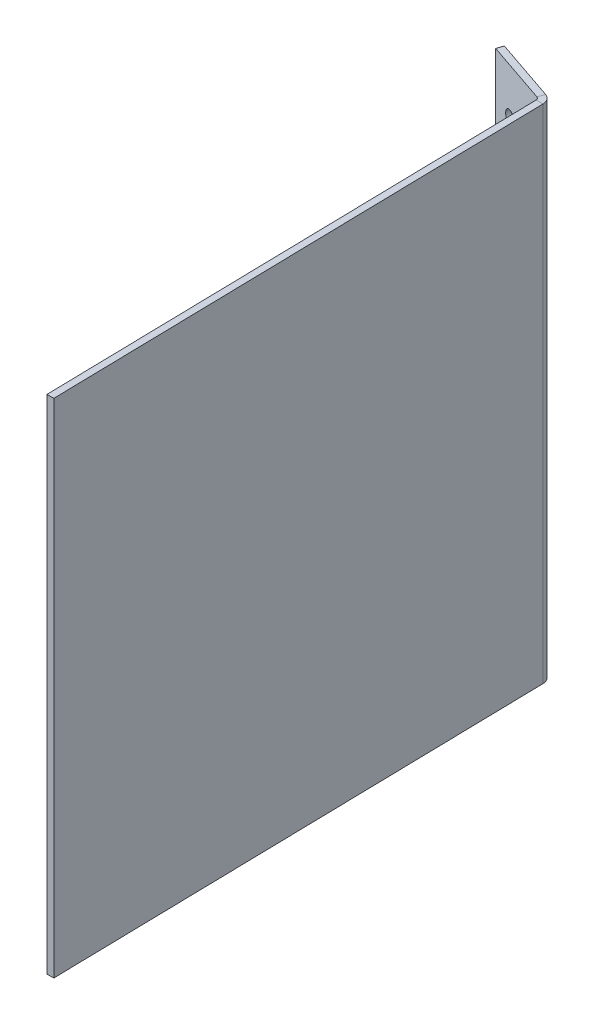
ISO-10303-21;
HEADER;
FILE_DESCRIPTION(('STEP AP214'),'2;1');
FILE_NAME('part.step','',(''),(''),'','','');
FILE_SCHEMA(('AUTOMOTIVE_DESIGN { 1 0 10303 214 1 1 1 1 }'));
ENDSEC;
DATA;
#1=APPLICATION_CONTEXT('core data for automotive mechanical design processes');
#2=APPLICATION_PROTOCOL_DEFINITION('international standard','automotive_design',2000,#1);
#3=PRODUCT_CONTEXT('',#1,'mechanical');
#4=PRODUCT('Part','Part','',(#3));
#5=PRODUCT_RELATED_PRODUCT_CATEGORY('part','',(#4));
#6=PRODUCT_DEFINITION_FORMATION('','',#4);
#7=PRODUCT_DEFINITION_CONTEXT('part definition',#1,'design');
#8=PRODUCT_DEFINITION('design','',#6,#7);
#9=PRODUCT_DEFINITION_SHAPE('','',#8);
#10=(LENGTH_UNIT() NAMED_UNIT(*) SI_UNIT(.MILLI.,.METRE.));
#11=(NAMED_UNIT(*) PLANE_ANGLE_UNIT() SI_UNIT($,.RADIAN.));
#12=(NAMED_UNIT(*) SI_UNIT($,.STERADIAN.) SOLID_ANGLE_UNIT());
#13=UNCERTAINTY_MEASURE_WITH_UNIT(LENGTH_MEASURE(1.E-05),#10,'distance_accuracy_value','');
#14=(GEOMETRIC_REPRESENTATION_CONTEXT(3) GLOBAL_UNCERTAINTY_ASSIGNED_CONTEXT((#13)) GLOBAL_UNIT_ASSIGNED_CONTEXT((#10,
#11,#12)) REPRESENTATION_CONTEXT('',''));
#15=CARTESIAN_POINT('',(0.,0.,0.));
#16=DIRECTION('',(0.,0.,1.));
#17=DIRECTION('',(1.,0.,0.));
#18=AXIS2_PLACEMENT_3D('',#15,#16,#17);
#19=CARTESIAN_POINT('',(-2.76921264471335,110.,-110.142664392987));
#20=DIRECTION('',(0.,1.,0.));
#21=DIRECTION('',(0.,0.,1.));
#22=AXIS2_PLACEMENT_3D('',#19,#20,#21);
#23=PLANE('',#22);
#24=DIRECTION('',(0.322460871920296,0.,-0.946582794096957));
#25=VECTOR('',#24,1.);
#26=CARTESIAN_POINT('',(-2.76921264471335,110.,-110.142664392987));
#27=LINE('',#26,#25);
#28=CARTESIAN_POINT('',(-2.76921264471335,110.,-110.142664392987));
#29=VERTEX_POINT('',#28);
#30=CARTESIAN_POINT('',(-2.2855213368329,110.,-111.562538584132));
#31=VERTEX_POINT('',#30);
#32=EDGE_CURVE('E11',#29,#31,#27,.T.);
#33=ORIENTED_EDGE('',*,*,#32,.F.);
#34=CARTESIAN_POINT('',(-3.00673732296983,110.,-109.445411506855));
#35=DIRECTION('',(0.,-1.,0.));
#36=DIRECTION('',(0.,0.,-1.));
#37=AXIS2_PLACEMENT_3D('',#34,#35,#36);
#38=CIRCLE('',#37,0.7366);
#39=CARTESIAN_POINT('',(-2.27029570654942,110.,-109.460685851492));
#40=VERTEX_POINT('',#39);
#41=EDGE_CURVE('E134',#40,#29,#38,.F.);
#42=ORIENTED_EDGE('',*,*,#41,.F.);
#43=DIRECTION('',(-0.999784980206917,0.,0.0207362810710025));
#44=VECTOR('',#43,1.);
#45=CARTESIAN_POINT('',(-0.770618236239044,110.,-109.491790273099));
#46=LINE('',#45,#44);
#47=CARTESIAN_POINT('',(-0.770618236239044,110.,-109.491790273099));
#48=VERTEX_POINT('',#47);
#49=EDGE_CURVE('E45',#48,#40,#46,.T.);
#50=ORIENTED_EDGE('',*,*,#49,.F.);
#51=CARTESIAN_POINT('',(-3.00673732296983,110.,-109.445411506855));
#52=DIRECTION('',(0.,1.,0.));
#53=DIRECTION('',(1.,0.,0.));
#54=AXIS2_PLACEMENT_3D('',#51,#52,#53);
#55=CIRCLE('',#54,2.2366);
#56=EDGE_CURVE('E127',#48,#31,#55,.T.);
#57=ORIENTED_EDGE('',*,*,#56,.T.);
#58=EDGE_LOOP('',(#33,#42,#50,#57));
#59=FACE_BOUND('',#58,.T.);
#60=ADVANCED_FACE('F37',(#59),#23,.T.);
#61=CARTESIAN_POINT('',(-0.770618236239044,110.,-109.491790273099));
#62=DIRECTION('',(0.,1.,0.));
#63=DIRECTION('',(0.,0.,1.));
#64=AXIS2_PLACEMENT_3D('',#61,#62,#63);
#65=PLANE('',#64);
#66=DIRECTION('',(-0.946582794096957,0.,-0.322460871920296));
#67=VECTOR('',#66,1.);
#68=CARTESIAN_POINT('',(-2.28099091780536,110.,-109.976347822761));
#69=LINE('',#68,#67);
#70=CARTESIAN_POINT('',(-16.4797328292597,110.,-114.813260901565));
#71=VERTEX_POINT('',#70);
#72=EDGE_CURVE('E184',#29,#71,#69,.T.);
#73=ORIENTED_EDGE('',*,*,#72,.F.);
#74=ORIENTED_EDGE('',*,*,#32,.T.);
#75=DIRECTION('',(-0.946582794096957,0.,-0.322460871920296));
#76=VECTOR('',#75,1.);
#77=CARTESIAN_POINT('',(-1.79729960992492,110.,-111.396222013906));
#78=LINE('',#77,#76);
#79=CARTESIAN_POINT('',(-15.9960415213793,110.,-116.233135092711));
#80=VERTEX_POINT('',#79);
#81=EDGE_CURVE('E93',#31,#80,#78,.T.);
#82=ORIENTED_EDGE('',*,*,#81,.T.);
#83=DIRECTION('',(0.322460871920295,0.,-0.946582794096958));
#84=VECTOR('',#83,1.);
#85=CARTESIAN_POINT('',(-16.4797328292597,110.,-114.813260901565));
#86=LINE('',#85,#84);
#87=EDGE_CURVE('E357',#71,#80,#86,.T.);
#88=ORIENTED_EDGE('',*,*,#87,.F.);
#89=EDGE_LOOP('',(#73,#74,#82,#88));
#90=FACE_BOUND('',#89,.T.);
#91=ADVANCED_FACE('F192',(#90),#65,.T.);
#92=CARTESIAN_POINT('',(-2.27029570654942,0.,-109.460685851492));
#93=DIRECTION('',(0.,-1.,0.));
#94=DIRECTION('',(0.,0.,-1.));
#95=AXIS2_PLACEMENT_3D('',#92,#93,#94);
#96=PLANE('',#95);
#97=DIRECTION('',(0.999784980206917,0.,-0.0207362810710025));
#98=VECTOR('',#97,1.);
#99=CARTESIAN_POINT('',(-2.27029570654942,0.,-109.460685851492));
#100=LINE('',#99,#98);
#101=CARTESIAN_POINT('',(-2.27029570654942,0.,-109.460685851492));
#102=VERTEX_POINT('',#101);
#103=CARTESIAN_POINT('',(-0.770618236239044,0.,-109.491790273099));
#104=VERTEX_POINT('',#103);
#105=EDGE_CURVE('E80',#102,#104,#100,.T.);
#106=ORIENTED_EDGE('',*,*,#105,.F.);
#107=CARTESIAN_POINT('',(-3.00673732296983,0.,-109.445411506855));
#108=DIRECTION('',(0.,-1.,0.));
#109=DIRECTION('',(0.,0.,-1.));
#110=AXIS2_PLACEMENT_3D('',#107,#108,#109);
#111=CIRCLE('',#110,0.7366);
#112=CARTESIAN_POINT('',(-2.76921264471335,0.,-110.142664392987));
#113=VERTEX_POINT('',#112);
#114=EDGE_CURVE('E150',#102,#113,#111,.F.);
#115=ORIENTED_EDGE('',*,*,#114,.T.);
#116=DIRECTION('',(-0.322460871920296,0.,0.946582794096957));
#117=VECTOR('',#116,1.);
#118=CARTESIAN_POINT('',(-2.2855213368329,0.,-111.562538584132));
#119=LINE('',#118,#117);
#120=CARTESIAN_POINT('',(-2.2855213368329,0.,-111.562538584132));
#121=VERTEX_POINT('',#120);
#122=EDGE_CURVE('E87',#121,#113,#119,.T.);
#123=ORIENTED_EDGE('',*,*,#122,.F.);
#124=CARTESIAN_POINT('',(-3.00673732296983,0.,-109.445411506855));
#125=DIRECTION('',(0.,1.,0.));
#126=DIRECTION('',(1.,0.,0.));
#127=AXIS2_PLACEMENT_3D('',#124,#125,#126);
#128=CIRCLE('',#127,2.2366);
#129=EDGE_CURVE('E157',#104,#121,#128,.T.);
#130=ORIENTED_EDGE('',*,*,#129,.F.);
#131=EDGE_LOOP('',(#106,#115,#123,#130));
#132=FACE_BOUND('',#131,.T.);
#133=ADVANCED_FACE('F190',(#132),#96,.T.);
#134=CARTESIAN_POINT('',(-2.2855213368329,0.,-111.562538584132));
#135=DIRECTION('',(0.,-1.,0.));
#136=DIRECTION('',(0.,0.,-1.));
#137=AXIS2_PLACEMENT_3D('',#134,#135,#136);
#138=PLANE('',#137);
#139=DIRECTION('',(-0.0207362810709579,0.,-0.999784980206918));
#140=VECTOR('',#139,1.);
#141=CARTESIAN_POINT('',(0.,0.,0.));
#142=LINE('',#141,#140);
#143=CARTESIAN_POINT('',(0.,0.,0.));
#144=VERTEX_POINT('',#143);
#145=EDGE_CURVE('E152',#144,#102,#142,.T.);
#146=ORIENTED_EDGE('',*,*,#145,.T.);
#147=ORIENTED_EDGE('',*,*,#105,.T.);
#148=DIRECTION('',(-0.0207362810709579,0.,-0.999784980206917));
#149=VECTOR('',#148,1.);
#150=CARTESIAN_POINT('',(1.49967747031038,0.,-0.0311044216064368));
#151=LINE('',#150,#149);
#152=CARTESIAN_POINT('',(1.49967747031038,0.,-0.0311044216064368));
#153=VERTEX_POINT('',#152);
#154=EDGE_CURVE('E155',#153,#104,#151,.T.);
#155=ORIENTED_EDGE('',*,*,#154,.F.);
#156=DIRECTION('',(-0.999784980206917,0.,0.0207362810709579));
#157=VECTOR('',#156,1.);
#158=CARTESIAN_POINT('',(1.49967747031038,0.,-0.0311044216064368));
#159=LINE('',#158,#157);
#160=EDGE_CURVE('E115',#153,#144,#159,.T.);
#161=ORIENTED_EDGE('',*,*,#160,.T.);
#162=EDGE_LOOP('',(#146,#147,#155,#161));
#163=FACE_BOUND('',#162,.T.);
#164=ADVANCED_FACE('F186',(#163),#138,.T.);
#165=CARTESIAN_POINT('',(-1.79729960992492,110.,-111.396222013906));
#166=DIRECTION('',(-0.322460871920296,0.,0.946582794096957));
#167=DIRECTION('',(0.946582794096957,0.,0.322460871920296));
#168=AXIS2_PLACEMENT_3D('',#165,#166,#167);
#169=PLANE('',#168);
#170=CARTESIAN_POINT('',(-11.2631275508945,9.99999999999999,-114.620830733109));
#171=DIRECTION('',(0.322460871920295,0.,-0.946582794096957));
#172=DIRECTION('',(-0.946582794096957,0.,-0.322460871920295));
#173=AXIS2_PLACEMENT_3D('',#170,#171,#172);
#174=CIRCLE('',#173,1.49999999999999);
#175=CARTESIAN_POINT('',(-12.6830017420399,9.99999999999999,-115.10452204099));
#176=VERTEX_POINT('',#175);
#177=EDGE_CURVE('E344',#176,#176,#174,.T.);
#178=ORIENTED_EDGE('',*,*,#177,.F.);
#179=EDGE_LOOP('',(#178));
#180=FACE_BOUND('',#179,.T.);
#181=CARTESIAN_POINT('',(-11.2631275508945,100.,-114.620830733109));
#182=DIRECTION('',(0.322460871920295,0.,-0.946582794096957));
#183=DIRECTION('',(-0.946582794096957,0.,-0.322460871920295));
#184=AXIS2_PLACEMENT_3D('',#181,#182,#183);
#185=CIRCLE('',#184,1.49999999999999);
#186=CARTESIAN_POINT('',(-12.6830017420399,100.,-115.10452204099));
#187=VERTEX_POINT('',#186);
#188=EDGE_CURVE('E348',#187,#187,#185,.T.);
#189=ORIENTED_EDGE('',*,*,#188,.F.);
#190=EDGE_LOOP('',(#189));
#191=FACE_BOUND('',#190,.T.);
#192=DIRECTION('',(-0.946582794096957,0.,-0.322460871920296));
#193=VECTOR('',#192,1.);
#194=CARTESIAN_POINT('',(-1.79729960992492,0.,-111.396222013906));
#195=LINE('',#194,#193);
#196=CARTESIAN_POINT('',(-15.9960415213793,0.,-116.233135092711));
#197=VERTEX_POINT('',#196);
#198=EDGE_CURVE('E140',#121,#197,#195,.T.);
#199=ORIENTED_EDGE('',*,*,#198,.T.);
#200=DIRECTION('',(0.,-1.,0.));
#201=VECTOR('',#200,1.);
#202=CARTESIAN_POINT('',(-15.9960415213793,110.,-116.233135092711));
#203=LINE('',#202,#201);
#204=EDGE_CURVE('E171',#80,#197,#203,.T.);
#205=ORIENTED_EDGE('',*,*,#204,.F.);
#206=ORIENTED_EDGE('',*,*,#81,.F.);
#207=DIRECTION('',(0.,-1.,0.));
#208=VECTOR('',#207,1.);
#209=CARTESIAN_POINT('',(-2.2855213368329,110.,-111.562538584132));
#210=LINE('',#209,#208);
#211=EDGE_CURVE('E139',#31,#121,#210,.T.);
#212=ORIENTED_EDGE('',*,*,#211,.T.);
#213=EDGE_LOOP('',(#199,#205,#206,#212));
#214=FACE_BOUND('',#213,.T.);
#215=ADVANCED_FACE('F198',(#180,#191,#214),#169,.F.);
#216=CARTESIAN_POINT('',(-16.4797328292597,110.,-114.813260901565));
#217=DIRECTION('',(-0.946582794096958,0.,-0.322460871920295));
#218=DIRECTION('',(-0.322460871920295,0.,0.946582794096958));
#219=AXIS2_PLACEMENT_3D('',#216,#217,#218);
#220=PLANE('',#219);
#221=DIRECTION('',(0.322460871920295,0.,-0.946582794096958));
#222=VECTOR('',#221,1.);
#223=CARTESIAN_POINT('',(-16.4797328292597,0.,-114.813260901565));
#224=LINE('',#223,#222);
#225=CARTESIAN_POINT('',(-16.4797328292597,0.,-114.813260901565));
#226=VERTEX_POINT('',#225);
#227=EDGE_CURVE('E143',#226,#197,#224,.T.);
#228=ORIENTED_EDGE('',*,*,#227,.F.);
#229=DIRECTION('',(0.,-1.,0.));
#230=VECTOR('',#229,1.);
#231=CARTESIAN_POINT('',(-16.4797328292597,110.,-114.813260901565));
#232=LINE('',#231,#230);
#233=EDGE_CURVE('E169',#71,#226,#232,.T.);
#234=ORIENTED_EDGE('',*,*,#233,.F.);
#235=ORIENTED_EDGE('',*,*,#87,.T.);
#236=ORIENTED_EDGE('',*,*,#204,.T.);
#237=EDGE_LOOP('',(#228,#234,#235,#236));
#238=FACE_BOUND('',#237,.T.);
#239=ADVANCED_FACE('F227',(#238),#220,.T.);
#240=CARTESIAN_POINT('',(-2.28099091780536,110.,-109.976347822761));
#241=DIRECTION('',(-0.322460871920296,0.,0.946582794096957));
#242=DIRECTION('',(0.946582794096957,0.,0.322460871920296));
#243=AXIS2_PLACEMENT_3D('',#240,#241,#242);
#244=PLANE('',#243);
#245=CARTESIAN_POINT('',(-11.7468188587749,9.99999999999999,-113.200956541964));
#246=DIRECTION('',(-0.322460871920296,0.,0.946582794096957));
#247=DIRECTION('',(0.946582794096957,0.,0.322460871920296));
#248=AXIS2_PLACEMENT_3D('',#245,#246,#247);
#249=CIRCLE('',#248,1.49999999999999);
#250=CARTESIAN_POINT('',(-10.3269446676295,9.99999999999999,-112.717265234083));
#251=VERTEX_POINT('',#250);
#252=EDGE_CURVE('E347',#251,#251,#249,.T.);
#253=ORIENTED_EDGE('',*,*,#252,.F.);
#254=EDGE_LOOP('',(#253));
#255=FACE_BOUND('',#254,.T.);
#256=CARTESIAN_POINT('',(-11.7468188587749,100.,-113.200956541964));
#257=DIRECTION('',(-0.322460871920296,0.,0.946582794096957));
#258=DIRECTION('',(0.946582794096957,0.,0.322460871920296));
#259=AXIS2_PLACEMENT_3D('',#256,#257,#258);
#260=CIRCLE('',#259,1.49999999999999);
#261=CARTESIAN_POINT('',(-10.3269446676295,100.,-112.717265234083));
#262=VERTEX_POINT('',#261);
#263=EDGE_CURVE('E144',#262,#262,#260,.T.);
#264=ORIENTED_EDGE('',*,*,#263,.F.);
#265=EDGE_LOOP('',(#264));
#266=FACE_BOUND('',#265,.T.);
#267=DIRECTION('',(-0.946582794096957,0.,-0.322460871920296));
#268=VECTOR('',#267,1.);
#269=CARTESIAN_POINT('',(-2.28099091780536,0.,-109.976347822761));
#270=LINE('',#269,#268);
#271=EDGE_CURVE('E147',#113,#226,#270,.T.);
#272=ORIENTED_EDGE('',*,*,#271,.F.);
#273=DIRECTION('',(0.,-1.,0.));
#274=VECTOR('',#273,1.);
#275=CARTESIAN_POINT('',(-2.76921264471335,110.,-110.142664392987));
#276=LINE('',#275,#274);
#277=EDGE_CURVE('E166',#29,#113,#276,.T.);
#278=ORIENTED_EDGE('',*,*,#277,.F.);
#279=ORIENTED_EDGE('',*,*,#72,.T.);
#280=ORIENTED_EDGE('',*,*,#233,.T.);
#281=EDGE_LOOP('',(#272,#278,#279,#280));
#282=FACE_BOUND('',#281,.T.);
#283=ADVANCED_FACE('F232',(#255,#266,#282),#244,.T.);
#284=CARTESIAN_POINT('',(-3.00673732296983,110.,-109.445411506855));
#285=DIRECTION('',(0.,-1.,0.));
#286=DIRECTION('',(0.,0.,-1.));
#287=AXIS2_PLACEMENT_3D('',#284,#285,#286);
#288=CYLINDRICAL_SURFACE('',#287,0.7366);
#289=ORIENTED_EDGE('',*,*,#114,.F.);
#290=DIRECTION('',(0.,-1.,0.));
#291=VECTOR('',#290,1.);
#292=CARTESIAN_POINT('',(-2.27029570654942,110.,-109.460685851492));
#293=LINE('',#292,#291);
#294=EDGE_CURVE('E163',#40,#102,#293,.T.);
#295=ORIENTED_EDGE('',*,*,#294,.F.);
#296=ORIENTED_EDGE('',*,*,#41,.T.);
#297=ORIENTED_EDGE('',*,*,#277,.T.);
#298=EDGE_LOOP('',(#289,#295,#296,#297));
#299=FACE_BOUND('',#298,.T.);
#300=ADVANCED_FACE('F180',(#299),#288,.F.);
#301=CARTESIAN_POINT('',(0.,110.,0.));
#302=DIRECTION('',(-0.999784980206917,0.,0.0207362810709579));
#303=DIRECTION('',(0.0207362810709579,0.,0.999784980206917));
#304=AXIS2_PLACEMENT_3D('',#301,#302,#303);
#305=PLANE('',#304);
#306=ORIENTED_EDGE('',*,*,#145,.F.);
#307=DIRECTION('',(0.,-1.,0.));
#308=VECTOR('',#307,1.);
#309=CARTESIAN_POINT('',(0.,110.,0.));
#310=LINE('',#309,#308);
#311=CARTESIAN_POINT('',(0.,110.,0.));
#312=VERTEX_POINT('',#311);
#313=EDGE_CURVE('E117',#312,#144,#310,.T.);
#314=ORIENTED_EDGE('',*,*,#313,.F.);
#315=DIRECTION('',(-0.0207362810709579,0.,-0.999784980206918));
#316=VECTOR('',#315,1.);
#317=CARTESIAN_POINT('',(0.,110.,0.));
#318=LINE('',#317,#316);
#319=EDGE_CURVE('E132',#312,#40,#318,.T.);
#320=ORIENTED_EDGE('',*,*,#319,.T.);
#321=ORIENTED_EDGE('',*,*,#294,.T.);
#322=EDGE_LOOP('',(#306,#314,#320,#321));
#323=FACE_BOUND('',#322,.T.);
#324=ADVANCED_FACE('F185',(#323),#305,.T.);
#325=CARTESIAN_POINT('',(1.49967747031038,110.,-0.0311044216064368));
#326=DIRECTION('',(0.0207362810709579,0.,0.999784980206918));
#327=DIRECTION('',(0.999784980206918,0.,-0.0207362810709579));
#328=AXIS2_PLACEMENT_3D('',#325,#326,#327);
#329=PLANE('',#328);
#330=ORIENTED_EDGE('',*,*,#160,.F.);
#331=DIRECTION('',(0.,-1.,0.));
#332=VECTOR('',#331,1.);
#333=CARTESIAN_POINT('',(1.49967747031038,110.,-0.0311044216064368));
#334=LINE('',#333,#332);
#335=CARTESIAN_POINT('',(1.49967747031038,110.,-0.0311044216064368));
#336=VERTEX_POINT('',#335);
#337=EDGE_CURVE('E109',#336,#153,#334,.T.);
#338=ORIENTED_EDGE('',*,*,#337,.F.);
#339=DIRECTION('',(-0.999784980206917,0.,0.0207362810709579));
#340=VECTOR('',#339,1.);
#341=CARTESIAN_POINT('',(1.49967747031038,110.,-0.0311044216064368));
#342=LINE('',#341,#340);
#343=EDGE_CURVE('E113',#336,#312,#342,.T.);
#344=ORIENTED_EDGE('',*,*,#343,.T.);
#345=ORIENTED_EDGE('',*,*,#313,.T.);
#346=EDGE_LOOP('',(#330,#338,#344,#345));
#347=FACE_BOUND('',#346,.T.);
#348=ADVANCED_FACE('F111',(#347),#329,.T.);
#349=CARTESIAN_POINT('',(1.49967747031038,110.,-0.0311044216064368));
#350=DIRECTION('',(-0.999784980206918,0.,0.0207362810709579));
#351=DIRECTION('',(0.0207362810709579,0.,0.999784980206918));
#352=AXIS2_PLACEMENT_3D('',#349,#350,#351);
#353=PLANE('',#352);
#354=ORIENTED_EDGE('',*,*,#154,.T.);
#355=DIRECTION('',(0.,-1.,0.));
#356=VECTOR('',#355,1.);
#357=CARTESIAN_POINT('',(-0.770618236239044,110.,-109.491790273099));
#358=LINE('',#357,#356);
#359=EDGE_CURVE('E118',#48,#104,#358,.T.);
#360=ORIENTED_EDGE('',*,*,#359,.F.);
#361=DIRECTION('',(-0.0207362810709579,0.,-0.999784980206917));
#362=VECTOR('',#361,1.);
#363=CARTESIAN_POINT('',(1.49967747031038,110.,-0.0311044216064368));
#364=LINE('',#363,#362);
#365=EDGE_CURVE('E122',#336,#48,#364,.T.);
#366=ORIENTED_EDGE('',*,*,#365,.F.);
#367=ORIENTED_EDGE('',*,*,#337,.T.);
#368=EDGE_LOOP('',(#354,#360,#366,#367));
#369=FACE_BOUND('',#368,.T.);
#370=ADVANCED_FACE('F123',(#369),#353,.F.);
#371=CARTESIAN_POINT('',(-3.00673732296983,110.,-109.445411506855));
#372=DIRECTION('',(0.,-1.,0.));
#373=DIRECTION('',(0.,0.,-1.));
#374=AXIS2_PLACEMENT_3D('',#371,#372,#373);
#375=CYLINDRICAL_SURFACE('',#374,2.2366);
#376=ORIENTED_EDGE('',*,*,#129,.T.);
#377=ORIENTED_EDGE('',*,*,#211,.F.);
#378=ORIENTED_EDGE('',*,*,#56,.F.);
#379=ORIENTED_EDGE('',*,*,#359,.T.);
#380=EDGE_LOOP('',(#376,#377,#378,#379));
#381=FACE_BOUND('',#380,.T.);
#382=ADVANCED_FACE('F188',(#381),#375,.T.);
#383=CARTESIAN_POINT('',(-3.00673732296983,110.,-109.445411506855));
#384=DIRECTION('',(0.,-1.,0.));
#385=DIRECTION('',(-1.,0.,0.));
#386=AXIS2_PLACEMENT_3D('',#383,#384,#385);
#387=PLANE('',#386);
#388=ORIENTED_EDGE('',*,*,#365,.T.);
#389=ORIENTED_EDGE('',*,*,#49,.T.);
#390=ORIENTED_EDGE('',*,*,#319,.F.);
#391=ORIENTED_EDGE('',*,*,#343,.F.);
#392=EDGE_LOOP('',(#388,#389,#390,#391));
#393=FACE_BOUND('',#392,.T.);
#394=ADVANCED_FACE('F130',(#393),#387,.F.);
#395=CARTESIAN_POINT('',(-3.00673732296983,0.,-109.445411506855));
#396=DIRECTION('',(0.,-1.,0.));
#397=DIRECTION('',(-1.,0.,0.));
#398=AXIS2_PLACEMENT_3D('',#395,#396,#397);
#399=PLANE('',#398);
#400=ORIENTED_EDGE('',*,*,#198,.F.);
#401=ORIENTED_EDGE('',*,*,#122,.T.);
#402=ORIENTED_EDGE('',*,*,#271,.T.);
#403=ORIENTED_EDGE('',*,*,#227,.T.);
#404=EDGE_LOOP('',(#400,#401,#402,#403));
#405=FACE_BOUND('',#404,.T.);
#406=ADVANCED_FACE('F290',(#405),#399,.T.);
#407=CARTESIAN_POINT('',(-11.2631275508945,100.,-114.620830733109));
#408=DIRECTION('',(0.322460871920295,0.,-0.946582794096957));
#409=DIRECTION('',(-0.946582794096957,0.,-0.322460871920295));
#410=AXIS2_PLACEMENT_3D('',#407,#408,#409);
#411=CYLINDRICAL_SURFACE('',#410,1.49999999999999);
#412=ORIENTED_EDGE('',*,*,#188,.T.);
#413=EDGE_LOOP('',(#412));
#414=FACE_BOUND('',#413,.T.);
#415=ORIENTED_EDGE('',*,*,#263,.T.);
#416=EDGE_LOOP('',(#415));
#417=FACE_BOUND('',#416,.T.);
#418=ADVANCED_FACE('F300',(#414,#417),#411,.F.);
#419=CARTESIAN_POINT('',(-11.2631275508945,9.99999999999999,-114.620830733109));
#420=DIRECTION('',(0.322460871920295,0.,-0.946582794096957));
#421=DIRECTION('',(-0.946582794096957,0.,-0.322460871920295));
#422=AXIS2_PLACEMENT_3D('',#419,#420,#421);
#423=CYLINDRICAL_SURFACE('',#422,1.49999999999999);
#424=ORIENTED_EDGE('',*,*,#177,.T.);
#425=EDGE_LOOP('',(#424));
#426=FACE_BOUND('',#425,.T.);
#427=ORIENTED_EDGE('',*,*,#252,.T.);
#428=EDGE_LOOP('',(#427));
#429=FACE_BOUND('',#428,.T.);
#430=ADVANCED_FACE('F327',(#426,#429),#423,.F.);
#431=CLOSED_SHELL('',(#60,#91,#133,#164,#215,#239,#283,#300,#324,#348,#370,#382,#394,#406,#418,#430));
#432=MANIFOLD_SOLID_BREP('B2',#431);
#433=ADVANCED_BREP_SHAPE_REPRESENTATION('',(#18,#432),#14);
#434=SHAPE_DEFINITION_REPRESENTATION(#9,#433);
ENDSEC;
END-ISO-10303-21;
